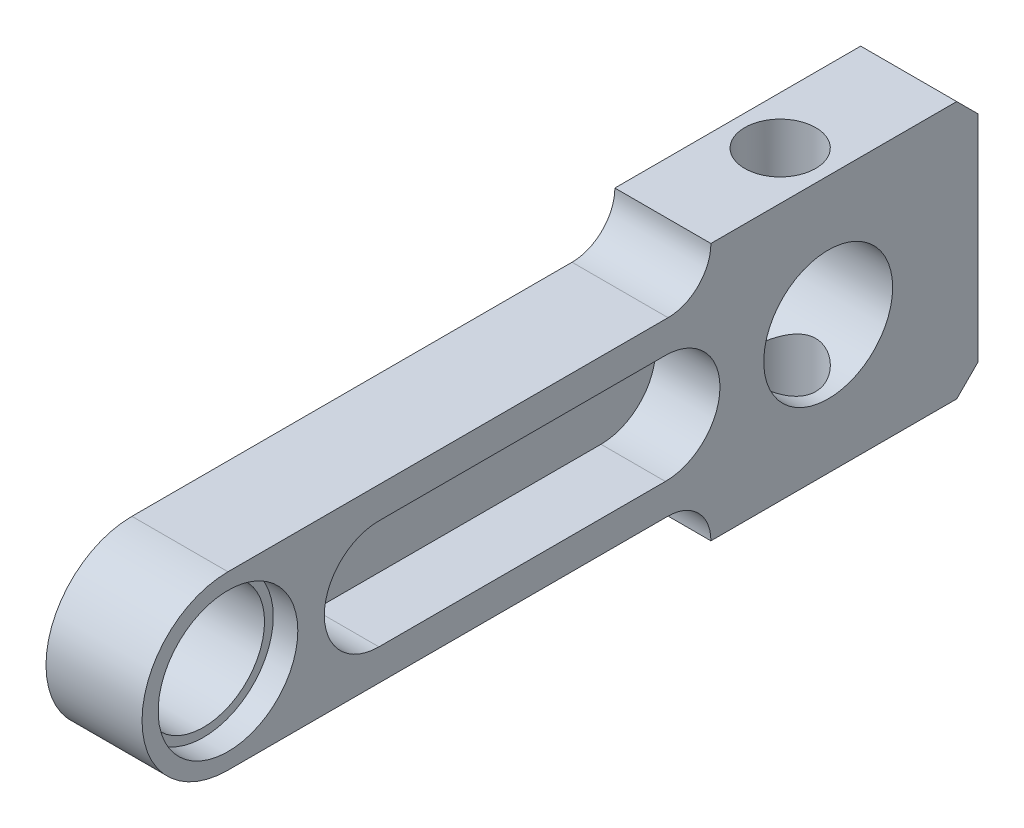
ISO-10303-21;
HEADER;
FILE_DESCRIPTION(('STEP AP214'),'2;1');
FILE_NAME('part.step','',(''),(''),'','','');
FILE_SCHEMA(('AUTOMOTIVE_DESIGN { 1 0 10303 214 1 1 1 1 }'));
ENDSEC;
DATA;
#1=APPLICATION_CONTEXT('core data for automotive mechanical design processes');
#2=APPLICATION_PROTOCOL_DEFINITION('international standard','automotive_design',2000,#1);
#3=PRODUCT_CONTEXT('',#1,'mechanical');
#4=PRODUCT('Part','Part','',(#3));
#5=PRODUCT_RELATED_PRODUCT_CATEGORY('part','',(#4));
#6=PRODUCT_DEFINITION_FORMATION('','',#4);
#7=PRODUCT_DEFINITION_CONTEXT('part definition',#1,'design');
#8=PRODUCT_DEFINITION('design','',#6,#7);
#9=PRODUCT_DEFINITION_SHAPE('','',#8);
#10=(LENGTH_UNIT() NAMED_UNIT(*) SI_UNIT(.MILLI.,.METRE.));
#11=(NAMED_UNIT(*) PLANE_ANGLE_UNIT() SI_UNIT($,.RADIAN.));
#12=(NAMED_UNIT(*) SI_UNIT($,.STERADIAN.) SOLID_ANGLE_UNIT());
#13=UNCERTAINTY_MEASURE_WITH_UNIT(LENGTH_MEASURE(1.E-05),#10,'distance_accuracy_value','');
#14=(GEOMETRIC_REPRESENTATION_CONTEXT(3) GLOBAL_UNCERTAINTY_ASSIGNED_CONTEXT((#13)) GLOBAL_UNIT_ASSIGNED_CONTEXT((#10,
#11,#12)) REPRESENTATION_CONTEXT('',''));
#15=CARTESIAN_POINT('',(0.,0.,0.));
#16=DIRECTION('',(0.,0.,1.));
#17=DIRECTION('',(1.,0.,0.));
#18=AXIS2_PLACEMENT_3D('',#15,#16,#17);
#19=CARTESIAN_POINT('',(3.49430570507718,-3.08121037131847E-06,-7.58954525222597));
#20=DIRECTION('',(-1.,0.,0.));
#21=DIRECTION('',(0.,0.,1.));
#22=AXIS2_PLACEMENT_3D('',#19,#20,#21);
#23=CYLINDRICAL_SURFACE('',#22,1.70688);
#24=CARTESIAN_POINT('',(0.812065705077182,-3.08121037131847E-06,-7.58954525222597));
#25=DIRECTION('',(1.,0.,0.));
#26=DIRECTION('',(0.,0.,-1.));
#27=AXIS2_PLACEMENT_3D('',#24,#25,#26);
#28=CIRCLE('',#27,1.70688);
#29=CARTESIAN_POINT('',(0.812065705077182,-3.08121037131847E-06,-9.29642525222597));
#30=VERTEX_POINT('',#29);
#31=EDGE_CURVE('E168',#30,#30,#28,.T.);
#32=ORIENTED_EDGE('',*,*,#31,.F.);
#33=EDGE_LOOP('',(#32));
#34=FACE_BOUND('',#33,.T.);
#35=CARTESIAN_POINT('',(2.80850570507718,-3.08121037131847E-06,-7.58954525222597));
#36=DIRECTION('',(1.,0.,0.));
#37=DIRECTION('',(0.,0.,-1.));
#38=AXIS2_PLACEMENT_3D('',#35,#36,#37);
#39=CIRCLE('',#38,1.70688);
#40=CARTESIAN_POINT('',(2.80850570507718,-3.08121037131847E-06,-9.29642525222597));
#41=VERTEX_POINT('',#40);
#42=EDGE_CURVE('E202',#41,#41,#39,.T.);
#43=ORIENTED_EDGE('',*,*,#42,.T.);
#44=EDGE_LOOP('',(#43));
#45=FACE_BOUND('',#44,.T.);
#46=ADVANCED_FACE('F35',(#34,#45),#23,.F.);
#47=CARTESIAN_POINT('',(3.49430570507718,-3.08121037131847E-06,-7.58954525222597));
#48=DIRECTION('',(1.,0.,0.));
#49=DIRECTION('',(0.,0.,-1.));
#50=AXIS2_PLACEMENT_3D('',#47,#48,#49);
#51=PLANE('',#50);
#52=CARTESIAN_POINT('',(3.49430570507718,-3.08121037131847E-06,-11.8051405121409));
#53=DIRECTION('',(1.,0.,0.));
#54=DIRECTION('',(0.,0.,-1.));
#55=AXIS2_PLACEMENT_3D('',#52,#53,#54);
#56=CIRCLE('',#55,1.524);
#57=CARTESIAN_POINT('',(3.49430570507718,1.52399691878963,-11.8051405121409));
#58=VERTEX_POINT('',#57);
#59=CARTESIAN_POINT('',(3.49430570507718,-1.52400308121037,-11.8051405121409));
#60=VERTEX_POINT('',#59);
#61=EDGE_CURVE('E57',#58,#60,#56,.T.);
#62=ORIENTED_EDGE('',*,*,#61,.F.);
#63=DIRECTION('',(0.,0.,1.));
#64=VECTOR('',#63,1.);
#65=CARTESIAN_POINT('',(3.49430570507718,1.52399691878963,-11.8051405121409));
#66=LINE('',#65,#64);
#67=CARTESIAN_POINT('',(3.49430570507718,1.52399691878963,-19.8061405121408));
#68=VERTEX_POINT('',#67);
#69=EDGE_CURVE('E351',#68,#58,#66,.T.);
#70=ORIENTED_EDGE('',*,*,#69,.F.);
#71=CARTESIAN_POINT('',(3.49430570507718,-3.08121037131847E-06,-19.8061405121408));
#72=DIRECTION('',(1.,0.,0.));
#73=DIRECTION('',(0.,0.,-1.));
#74=AXIS2_PLACEMENT_3D('',#71,#72,#73);
#75=CIRCLE('',#74,1.524);
#76=CARTESIAN_POINT('',(3.49430570507718,-1.52400308121037,-19.8061405121408));
#77=VERTEX_POINT('',#76);
#78=EDGE_CURVE('E355',#77,#68,#75,.T.);
#79=ORIENTED_EDGE('',*,*,#78,.F.);
#80=DIRECTION('',(0.,0.,-1.));
#81=VECTOR('',#80,1.);
#82=CARTESIAN_POINT('',(3.49430570507718,-1.52400308121037,-11.8051405121409));
#83=LINE('',#82,#81);
#84=EDGE_CURVE('E358',#60,#77,#83,.T.);
#85=ORIENTED_EDGE('',*,*,#84,.F.);
#86=EDGE_LOOP('',(#62,#70,#79,#85));
#87=FACE_BOUND('',#86,.T.);
#88=CARTESIAN_POINT('',(3.49430570507718,-3.08121037131847E-06,-7.58954525222597));
#89=DIRECTION('',(1.,0.,0.));
#90=DIRECTION('',(0.,0.,-1.));
#91=AXIS2_PLACEMENT_3D('',#88,#89,#90);
#92=CIRCLE('',#91,1.95072);
#93=CARTESIAN_POINT('',(3.49430570507718,-3.08121037131847E-06,-9.54026525222597));
#94=VERTEX_POINT('',#93);
#95=EDGE_CURVE('E335',#94,#94,#92,.T.);
#96=ORIENTED_EDGE('',*,*,#95,.F.);
#97=EDGE_LOOP('',(#96));
#98=FACE_BOUND('',#97,.T.);
#99=CARTESIAN_POINT('',(3.49430570507718,-3.08121037131847E-06,-7.58954525222597));
#100=DIRECTION('',(1.,0.,0.));
#101=DIRECTION('',(0.,0.,-1.));
#102=AXIS2_PLACEMENT_3D('',#99,#100,#101);
#103=CIRCLE('',#102,2.4000000768);
#104=CARTESIAN_POINT('',(3.49430570507718,2.39999699558963,-7.58954525222597));
#105=VERTEX_POINT('',#104);
#106=CARTESIAN_POINT('',(3.49430570507718,-2.40000315801037,-7.58954525222597));
#107=VERTEX_POINT('',#106);
#108=EDGE_CURVE('E184',#105,#107,#103,.T.);
#109=ORIENTED_EDGE('',*,*,#108,.T.);
#110=DIRECTION('',(0.,0.,-1.));
#111=VECTOR('',#110,1.);
#112=CARTESIAN_POINT('',(3.49430570507718,-2.40000315801037,-7.58954525222597));
#113=LINE('',#112,#111);
#114=CARTESIAN_POINT('',(3.49430570507718,-2.40000315801037,-19.880905175426));
#115=VERTEX_POINT('',#114);
#116=EDGE_CURVE('E113',#107,#115,#113,.T.);
#117=ORIENTED_EDGE('',*,*,#116,.T.);
#118=CARTESIAN_POINT('',(3.49430570507718,-3.59664308121037,-19.880905175426));
#119=DIRECTION('',(-1.,0.,0.));
#120=DIRECTION('',(0.,0.,-1.));
#121=AXIS2_PLACEMENT_3D('',#118,#119,#120);
#122=CIRCLE('',#121,1.1966399232);
#123=CARTESIAN_POINT('',(3.49430570507718,-3.59664308121037,-21.077545098626));
#124=VERTEX_POINT('',#123);
#125=EDGE_CURVE('E307',#115,#124,#122,.T.);
#126=ORIENTED_EDGE('',*,*,#125,.T.);
#127=DIRECTION('',(0.,0.,-1.));
#128=VECTOR('',#127,1.);
#129=CARTESIAN_POINT('',(3.49430570507718,-3.59664308121037,-21.077545098626));
#130=LINE('',#129,#128);
#131=CARTESIAN_POINT('',(3.49430570507718,-3.59664308121037,-27.942865175426));
#132=VERTEX_POINT('',#131);
#133=EDGE_CURVE('E320',#124,#132,#130,.T.);
#134=ORIENTED_EDGE('',*,*,#133,.T.);
#135=DIRECTION('',(0.,0.707106781186547,-0.707106781186548));
#136=VECTOR('',#135,1.);
#137=CARTESIAN_POINT('',(3.49430570507718,-3.59664308121037,-27.942865175426));
#138=LINE('',#137,#136);
#139=CARTESIAN_POINT('',(3.49430570507718,-3.00228308121037,-28.537225175426));
#140=VERTEX_POINT('',#139);
#141=EDGE_CURVE('E317',#132,#140,#138,.T.);
#142=ORIENTED_EDGE('',*,*,#141,.T.);
#143=DIRECTION('',(0.,1.,0.));
#144=VECTOR('',#143,1.);
#145=CARTESIAN_POINT('',(3.49430570507718,-3.00228308121037,-28.537225175426));
#146=LINE('',#145,#144);
#147=CARTESIAN_POINT('',(3.49430570507718,3.00227691878963,-28.537225175426));
#148=VERTEX_POINT('',#147);
#149=EDGE_CURVE('E319',#140,#148,#146,.T.);
#150=ORIENTED_EDGE('',*,*,#149,.T.);
#151=DIRECTION('',(0.,0.707106781186547,0.707106781186548));
#152=VECTOR('',#151,1.);
#153=CARTESIAN_POINT('',(3.49430570507718,3.59663691878963,-27.942865175426));
#154=LINE('',#153,#152);
#155=CARTESIAN_POINT('',(3.49430570507718,3.59663691878963,-27.942865175426));
#156=VERTEX_POINT('',#155);
#157=EDGE_CURVE('E143',#148,#156,#154,.T.);
#158=ORIENTED_EDGE('',*,*,#157,.T.);
#159=DIRECTION('',(0.,0.,1.));
#160=VECTOR('',#159,1.);
#161=CARTESIAN_POINT('',(3.49430570507718,3.59663691878963,-21.077545098626));
#162=LINE('',#161,#160);
#163=CARTESIAN_POINT('',(3.49430570507718,3.59663691878963,-21.077545098626));
#164=VERTEX_POINT('',#163);
#165=EDGE_CURVE('E135',#156,#164,#162,.T.);
#166=ORIENTED_EDGE('',*,*,#165,.T.);
#167=CARTESIAN_POINT('',(3.49430570507718,3.59663691878963,-19.880905175426));
#168=DIRECTION('',(-1.,0.,0.));
#169=DIRECTION('',(0.,0.,-1.));
#170=AXIS2_PLACEMENT_3D('',#167,#168,#169);
#171=CIRCLE('',#170,1.1966399232);
#172=CARTESIAN_POINT('',(3.49430570507718,2.39999699558963,-19.880905175426));
#173=VERTEX_POINT('',#172);
#174=EDGE_CURVE('E140',#164,#173,#171,.T.);
#175=ORIENTED_EDGE('',*,*,#174,.T.);
#176=DIRECTION('',(0.,0.,1.));
#177=VECTOR('',#176,1.);
#178=CARTESIAN_POINT('',(3.49430570507718,2.39999699558963,-7.58954525222597));
#179=LINE('',#178,#177);
#180=EDGE_CURVE('E66',#173,#105,#179,.T.);
#181=ORIENTED_EDGE('',*,*,#180,.T.);
#182=EDGE_LOOP('',(#109,#117,#126,#134,#142,#150,#158,#166,#175,#181));
#183=FACE_BOUND('',#182,.T.);
#184=CARTESIAN_POINT('',(3.49430570507718,-3.08121037131847E-06,-24.353545252226));
#185=DIRECTION('',(1.,0.,0.));
#186=DIRECTION('',(0.,0.,-1.));
#187=AXIS2_PLACEMENT_3D('',#184,#185,#186);
#188=CIRCLE('',#187,1.7999999814);
#189=CARTESIAN_POINT('',(3.49430570507718,-3.08121037131847E-06,-26.153545233626));
#190=VERTEX_POINT('',#189);
#191=EDGE_CURVE('E330',#190,#190,#188,.T.);
#192=ORIENTED_EDGE('',*,*,#191,.F.);
#193=EDGE_LOOP('',(#192));
#194=FACE_BOUND('',#193,.T.);
#195=ADVANCED_FACE('F137',(#87,#98,#183,#194),#51,.T.);
#196=CARTESIAN_POINT('',(0.812065705077182,-3.08121037131847E-06,-7.58954525222597));
#197=DIRECTION('',(1.,0.,0.));
#198=DIRECTION('',(0.,0.,-1.));
#199=AXIS2_PLACEMENT_3D('',#196,#197,#198);
#200=PLANE('',#199);
#201=ORIENTED_EDGE('',*,*,#31,.T.);
#202=EDGE_LOOP('',(#201));
#203=FACE_BOUND('',#202,.T.);
#204=CARTESIAN_POINT('',(0.812065705077182,-3.08121037131847E-06,-7.58954525222597));
#205=DIRECTION('',(1.,0.,0.));
#206=DIRECTION('',(0.,0.,-1.));
#207=AXIS2_PLACEMENT_3D('',#204,#205,#206);
#208=CIRCLE('',#207,2.4000000768);
#209=CARTESIAN_POINT('',(0.812065705077182,2.39999699558963,-7.58954525222597));
#210=VERTEX_POINT('',#209);
#211=CARTESIAN_POINT('',(0.812065705077182,-2.40000315801037,-7.58954525222597));
#212=VERTEX_POINT('',#211);
#213=EDGE_CURVE('E164',#210,#212,#208,.T.);
#214=ORIENTED_EDGE('',*,*,#213,.F.);
#215=DIRECTION('',(0.,0.,1.));
#216=VECTOR('',#215,1.);
#217=CARTESIAN_POINT('',(0.812065705077182,2.39999699558963,-7.58954525222597));
#218=LINE('',#217,#216);
#219=CARTESIAN_POINT('',(0.812065705077182,2.39999699558963,-19.880905175426));
#220=VERTEX_POINT('',#219);
#221=EDGE_CURVE('E105',#220,#210,#218,.T.);
#222=ORIENTED_EDGE('',*,*,#221,.F.);
#223=CARTESIAN_POINT('',(0.812065705077182,3.59663691878963,-19.880905175426));
#224=DIRECTION('',(-1.,0.,0.));
#225=DIRECTION('',(0.,0.,-1.));
#226=AXIS2_PLACEMENT_3D('',#223,#224,#225);
#227=CIRCLE('',#226,1.1966399232);
#228=CARTESIAN_POINT('',(0.812065705077182,3.59663691878963,-21.077545098626));
#229=VERTEX_POINT('',#228);
#230=EDGE_CURVE('E181',#229,#220,#227,.T.);
#231=ORIENTED_EDGE('',*,*,#230,.F.);
#232=DIRECTION('',(0.,0.,1.));
#233=VECTOR('',#232,1.);
#234=CARTESIAN_POINT('',(0.812065705077182,3.59663691878963,-21.077545098626));
#235=LINE('',#234,#233);
#236=CARTESIAN_POINT('',(0.812065705077182,3.59663691878963,-27.942865175426));
#237=VERTEX_POINT('',#236);
#238=EDGE_CURVE('E152',#237,#229,#235,.T.);
#239=ORIENTED_EDGE('',*,*,#238,.F.);
#240=DIRECTION('',(0.,0.707106781186547,0.707106781186548));
#241=VECTOR('',#240,1.);
#242=CARTESIAN_POINT('',(0.812065705077182,3.59663691878963,-27.942865175426));
#243=LINE('',#242,#241);
#244=CARTESIAN_POINT('',(0.812065705077182,3.00227691878963,-28.537225175426));
#245=VERTEX_POINT('',#244);
#246=EDGE_CURVE('E178',#245,#237,#243,.T.);
#247=ORIENTED_EDGE('',*,*,#246,.F.);
#248=DIRECTION('',(0.,1.,0.));
#249=VECTOR('',#248,1.);
#250=CARTESIAN_POINT('',(0.812065705077182,-3.00228308121037,-28.537225175426));
#251=LINE('',#250,#249);
#252=CARTESIAN_POINT('',(0.812065705077182,-3.00228308121037,-28.537225175426));
#253=VERTEX_POINT('',#252);
#254=EDGE_CURVE('E176',#253,#245,#251,.T.);
#255=ORIENTED_EDGE('',*,*,#254,.F.);
#256=DIRECTION('',(0.,0.707106781186547,-0.707106781186548));
#257=VECTOR('',#256,1.);
#258=CARTESIAN_POINT('',(0.812065705077182,-3.59664308121037,-27.942865175426));
#259=LINE('',#258,#257);
#260=CARTESIAN_POINT('',(0.812065705077182,-3.59664308121037,-27.942865175426));
#261=VERTEX_POINT('',#260);
#262=EDGE_CURVE('E174',#261,#253,#259,.T.);
#263=ORIENTED_EDGE('',*,*,#262,.F.);
#264=DIRECTION('',(0.,0.,-1.));
#265=VECTOR('',#264,1.);
#266=CARTESIAN_POINT('',(0.812065705077182,-3.59664308121037,-21.077545098626));
#267=LINE('',#266,#265);
#268=CARTESIAN_POINT('',(0.812065705077182,-3.59664308121037,-21.077545098626));
#269=VERTEX_POINT('',#268);
#270=EDGE_CURVE('E172',#269,#261,#267,.T.);
#271=ORIENTED_EDGE('',*,*,#270,.F.);
#272=CARTESIAN_POINT('',(0.812065705077182,-3.59664308121037,-19.880905175426));
#273=DIRECTION('',(-1.,0.,0.));
#274=DIRECTION('',(0.,0.,-1.));
#275=AXIS2_PLACEMENT_3D('',#272,#273,#274);
#276=CIRCLE('',#275,1.1966399232);
#277=CARTESIAN_POINT('',(0.812065705077182,-2.40000315801037,-19.880905175426));
#278=VERTEX_POINT('',#277);
#279=EDGE_CURVE('E170',#278,#269,#276,.T.);
#280=ORIENTED_EDGE('',*,*,#279,.F.);
#281=DIRECTION('',(0.,0.,-1.));
#282=VECTOR('',#281,1.);
#283=CARTESIAN_POINT('',(0.812065705077182,-2.40000315801037,-7.58954525222597));
#284=LINE('',#283,#282);
#285=EDGE_CURVE('E167',#212,#278,#284,.T.);
#286=ORIENTED_EDGE('',*,*,#285,.F.);
#287=EDGE_LOOP('',(#214,#222,#231,#239,#247,#255,#263,#271,#280,#286));
#288=FACE_BOUND('',#287,.T.);
#289=CARTESIAN_POINT('',(0.812065705077182,-3.08121037131847E-06,-24.353545252226));
#290=DIRECTION('',(1.,0.,0.));
#291=DIRECTION('',(0.,0.,-1.));
#292=AXIS2_PLACEMENT_3D('',#289,#290,#291);
#293=CIRCLE('',#292,1.7999999814);
#294=CARTESIAN_POINT('',(0.812065705077182,-3.08121037131847E-06,-26.153545233626));
#295=VERTEX_POINT('',#294);
#296=EDGE_CURVE('E204',#295,#295,#293,.T.);
#297=ORIENTED_EDGE('',*,*,#296,.T.);
#298=EDGE_LOOP('',(#297));
#299=FACE_BOUND('',#298,.T.);
#300=ADVANCED_FACE('F260',(#203,#288,#299),#200,.F.);
#301=CARTESIAN_POINT('',(3.49430570507718,-3.08121037131847E-06,-7.58954525222597));
#302=DIRECTION('',(-1.,0.,0.));
#303=DIRECTION('',(0.,0.,1.));
#304=AXIS2_PLACEMENT_3D('',#301,#302,#303);
#305=CYLINDRICAL_SURFACE('',#304,2.4000000768);
#306=ORIENTED_EDGE('',*,*,#213,.T.);
#307=DIRECTION('',(-1.,0.,0.));
#308=VECTOR('',#307,1.);
#309=CARTESIAN_POINT('',(3.49430570507718,-2.40000315801037,-7.58954525222597));
#310=LINE('',#309,#308);
#311=EDGE_CURVE('E11',#107,#212,#310,.T.);
#312=ORIENTED_EDGE('',*,*,#311,.F.);
#313=ORIENTED_EDGE('',*,*,#108,.F.);
#314=DIRECTION('',(-1.,0.,0.));
#315=VECTOR('',#314,1.);
#316=CARTESIAN_POINT('',(3.49430570507718,2.39999699558963,-7.58954525222597));
#317=LINE('',#316,#315);
#318=EDGE_CURVE('E160',#105,#210,#317,.T.);
#319=ORIENTED_EDGE('',*,*,#318,.T.);
#320=EDGE_LOOP('',(#306,#312,#313,#319));
#321=FACE_BOUND('',#320,.T.);
#322=ADVANCED_FACE('F37',(#321),#305,.T.);
#323=CARTESIAN_POINT('',(3.49430570507718,-2.40000315801037,-7.58954525222597));
#324=DIRECTION('',(0.,1.,0.));
#325=DIRECTION('',(0.,0.,1.));
#326=AXIS2_PLACEMENT_3D('',#323,#324,#325);
#327=PLANE('',#326);
#328=ORIENTED_EDGE('',*,*,#285,.T.);
#329=DIRECTION('',(-1.,0.,0.));
#330=VECTOR('',#329,1.);
#331=CARTESIAN_POINT('',(3.49430570507718,-2.40000315801037,-19.880905175426));
#332=LINE('',#331,#330);
#333=EDGE_CURVE('E49',#115,#278,#332,.T.);
#334=ORIENTED_EDGE('',*,*,#333,.F.);
#335=ORIENTED_EDGE('',*,*,#116,.F.);
#336=ORIENTED_EDGE('',*,*,#311,.T.);
#337=EDGE_LOOP('',(#328,#334,#335,#336));
#338=FACE_BOUND('',#337,.T.);
#339=ADVANCED_FACE('F294',(#338),#327,.F.);
#340=CARTESIAN_POINT('',(3.49430570507718,-3.59664308121037,-19.880905175426));
#341=DIRECTION('',(-1.,0.,0.));
#342=DIRECTION('',(0.,0.,1.));
#343=AXIS2_PLACEMENT_3D('',#340,#341,#342);
#344=CYLINDRICAL_SURFACE('',#343,1.1966399232);
#345=ORIENTED_EDGE('',*,*,#279,.T.);
#346=DIRECTION('',(-1.,0.,0.));
#347=VECTOR('',#346,1.);
#348=CARTESIAN_POINT('',(3.49430570507718,-3.59664308121037,-21.077545098626));
#349=LINE('',#348,#347);
#350=EDGE_CURVE('E197',#124,#269,#349,.T.);
#351=ORIENTED_EDGE('',*,*,#350,.F.);
#352=ORIENTED_EDGE('',*,*,#125,.F.);
#353=ORIENTED_EDGE('',*,*,#333,.T.);
#354=EDGE_LOOP('',(#345,#351,#352,#353));
#355=FACE_BOUND('',#354,.T.);
#356=ADVANCED_FACE('F291',(#355),#344,.F.);
#357=CARTESIAN_POINT('',(3.49430570507718,-3.59664308121037,-21.077545098626));
#358=DIRECTION('',(0.,1.,0.));
#359=DIRECTION('',(0.,0.,1.));
#360=AXIS2_PLACEMENT_3D('',#357,#358,#359);
#361=PLANE('',#360);
#362=CARTESIAN_POINT('',(2.15318570507718,-3.59664308121037,-24.353545252226));
#363=DIRECTION('',(0.,-1.,0.));
#364=DIRECTION('',(0.,0.,-1.));
#365=AXIS2_PLACEMENT_3D('',#362,#363,#364);
#366=CIRCLE('',#365,0.9906);
#367=CARTESIAN_POINT('',(2.15318570507718,-3.59664308121037,-25.344145252226));
#368=VERTEX_POINT('',#367);
#369=EDGE_CURVE('E372',#368,#368,#366,.T.);
#370=ORIENTED_EDGE('',*,*,#369,.F.);
#371=EDGE_LOOP('',(#370));
#372=FACE_BOUND('',#371,.T.);
#373=ORIENTED_EDGE('',*,*,#270,.T.);
#374=DIRECTION('',(-1.,0.,0.));
#375=VECTOR('',#374,1.);
#376=CARTESIAN_POINT('',(3.49430570507718,-3.59664308121037,-27.942865175426));
#377=LINE('',#376,#375);
#378=EDGE_CURVE('E194',#132,#261,#377,.T.);
#379=ORIENTED_EDGE('',*,*,#378,.F.);
#380=ORIENTED_EDGE('',*,*,#133,.F.);
#381=ORIENTED_EDGE('',*,*,#350,.T.);
#382=EDGE_LOOP('',(#373,#379,#380,#381));
#383=FACE_BOUND('',#382,.T.);
#384=ADVANCED_FACE('F287',(#372,#383),#361,.F.);
#385=CARTESIAN_POINT('',(3.49430570507718,-3.59664308121037,-27.942865175426));
#386=DIRECTION('',(0.,0.707106781186548,0.707106781186547));
#387=DIRECTION('',(0.,-0.707106781186547,0.707106781186548));
#388=AXIS2_PLACEMENT_3D('',#385,#386,#387);
#389=PLANE('',#388);
#390=ORIENTED_EDGE('',*,*,#262,.T.);
#391=DIRECTION('',(-1.,0.,0.));
#392=VECTOR('',#391,1.);
#393=CARTESIAN_POINT('',(3.49430570507718,-3.00228308121037,-28.537225175426));
#394=LINE('',#393,#392);
#395=EDGE_CURVE('E191',#140,#253,#394,.T.);
#396=ORIENTED_EDGE('',*,*,#395,.F.);
#397=ORIENTED_EDGE('',*,*,#141,.F.);
#398=ORIENTED_EDGE('',*,*,#378,.T.);
#399=EDGE_LOOP('',(#390,#396,#397,#398));
#400=FACE_BOUND('',#399,.T.);
#401=ADVANCED_FACE('F283',(#400),#389,.F.);
#402=CARTESIAN_POINT('',(3.49430570507718,-3.00228308121037,-28.537225175426));
#403=DIRECTION('',(0.,0.,1.));
#404=DIRECTION('',(1.,0.,0.));
#405=AXIS2_PLACEMENT_3D('',#402,#403,#404);
#406=PLANE('',#405);
#407=ORIENTED_EDGE('',*,*,#254,.T.);
#408=DIRECTION('',(-1.,0.,0.));
#409=VECTOR('',#408,1.);
#410=CARTESIAN_POINT('',(3.49430570507718,3.00227691878963,-28.537225175426));
#411=LINE('',#410,#409);
#412=EDGE_CURVE('E188',#148,#245,#411,.T.);
#413=ORIENTED_EDGE('',*,*,#412,.F.);
#414=ORIENTED_EDGE('',*,*,#149,.F.);
#415=ORIENTED_EDGE('',*,*,#395,.T.);
#416=EDGE_LOOP('',(#407,#413,#414,#415));
#417=FACE_BOUND('',#416,.T.);
#418=ADVANCED_FACE('F279',(#417),#406,.F.);
#419=CARTESIAN_POINT('',(3.49430570507718,3.59663691878963,-27.942865175426));
#420=DIRECTION('',(0.,-0.707106781186548,0.707106781186547));
#421=DIRECTION('',(0.,-0.707106781186547,-0.707106781186548));
#422=AXIS2_PLACEMENT_3D('',#419,#420,#421);
#423=PLANE('',#422);
#424=ORIENTED_EDGE('',*,*,#246,.T.);
#425=DIRECTION('',(-1.,0.,0.));
#426=VECTOR('',#425,1.);
#427=CARTESIAN_POINT('',(3.49430570507718,3.59663691878963,-27.942865175426));
#428=LINE('',#427,#426);
#429=EDGE_CURVE('E155',#156,#237,#428,.T.);
#430=ORIENTED_EDGE('',*,*,#429,.F.);
#431=ORIENTED_EDGE('',*,*,#157,.F.);
#432=ORIENTED_EDGE('',*,*,#412,.T.);
#433=EDGE_LOOP('',(#424,#430,#431,#432));
#434=FACE_BOUND('',#433,.T.);
#435=ADVANCED_FACE('F275',(#434),#423,.F.);
#436=CARTESIAN_POINT('',(3.49430570507718,3.59663691878963,-21.077545098626));
#437=DIRECTION('',(0.,-1.,0.));
#438=DIRECTION('',(0.,0.,-1.));
#439=AXIS2_PLACEMENT_3D('',#436,#437,#438);
#440=PLANE('',#439);
#441=CARTESIAN_POINT('',(2.15318570507718,3.59663691878963,-24.353545252226));
#442=DIRECTION('',(0.,-1.,0.));
#443=DIRECTION('',(0.,0.,-1.));
#444=AXIS2_PLACEMENT_3D('',#441,#442,#443);
#445=CIRCLE('',#444,0.9906);
#446=CARTESIAN_POINT('',(2.15318570507718,3.59663691878963,-25.344145252226));
#447=VERTEX_POINT('',#446);
#448=EDGE_CURVE('E211',#447,#447,#445,.T.);
#449=ORIENTED_EDGE('',*,*,#448,.T.);
#450=EDGE_LOOP('',(#449));
#451=FACE_BOUND('',#450,.T.);
#452=ORIENTED_EDGE('',*,*,#238,.T.);
#453=DIRECTION('',(-1.,0.,0.));
#454=VECTOR('',#453,1.);
#455=CARTESIAN_POINT('',(3.49430570507718,3.59663691878963,-21.077545098626));
#456=LINE('',#455,#454);
#457=EDGE_CURVE('E149',#164,#229,#456,.T.);
#458=ORIENTED_EDGE('',*,*,#457,.F.);
#459=ORIENTED_EDGE('',*,*,#165,.F.);
#460=ORIENTED_EDGE('',*,*,#429,.T.);
#461=EDGE_LOOP('',(#452,#458,#459,#460));
#462=FACE_BOUND('',#461,.T.);
#463=ADVANCED_FACE('F150',(#451,#462),#440,.F.);
#464=CARTESIAN_POINT('',(3.49430570507718,3.59663691878963,-19.880905175426));
#465=DIRECTION('',(-1.,0.,0.));
#466=DIRECTION('',(0.,0.,1.));
#467=AXIS2_PLACEMENT_3D('',#464,#465,#466);
#468=CYLINDRICAL_SURFACE('',#467,1.1966399232);
#469=ORIENTED_EDGE('',*,*,#230,.T.);
#470=DIRECTION('',(-1.,0.,0.));
#471=VECTOR('',#470,1.);
#472=CARTESIAN_POINT('',(3.49430570507718,2.39999699558963,-19.880905175426));
#473=LINE('',#472,#471);
#474=EDGE_CURVE('E156',#173,#220,#473,.T.);
#475=ORIENTED_EDGE('',*,*,#474,.F.);
#476=ORIENTED_EDGE('',*,*,#174,.F.);
#477=ORIENTED_EDGE('',*,*,#457,.T.);
#478=EDGE_LOOP('',(#469,#475,#476,#477));
#479=FACE_BOUND('',#478,.T.);
#480=ADVANCED_FACE('F158',(#479),#468,.F.);
#481=CARTESIAN_POINT('',(3.49430570507718,2.39999699558963,-7.58954525222597));
#482=DIRECTION('',(0.,-1.,0.));
#483=DIRECTION('',(0.,0.,-1.));
#484=AXIS2_PLACEMENT_3D('',#481,#482,#483);
#485=PLANE('',#484);
#486=ORIENTED_EDGE('',*,*,#221,.T.);
#487=ORIENTED_EDGE('',*,*,#318,.F.);
#488=ORIENTED_EDGE('',*,*,#180,.F.);
#489=ORIENTED_EDGE('',*,*,#474,.T.);
#490=EDGE_LOOP('',(#486,#487,#488,#489));
#491=FACE_BOUND('',#490,.T.);
#492=ADVANCED_FACE('F251',(#491),#485,.F.);
#493=CARTESIAN_POINT('',(3.49430570507718,-3.08121037131847E-06,-24.353545252226));
#494=DIRECTION('',(-1.,0.,0.));
#495=DIRECTION('',(0.,0.,1.));
#496=AXIS2_PLACEMENT_3D('',#493,#494,#495);
#497=CYLINDRICAL_SURFACE('',#496,1.7999999814);
#498=CARTESIAN_POINT('',(2.15318570507718,1.50289797110146,-25.344145252226));
#499=CARTESIAN_POINT('',(2.2039478107877,1.50290334140621,-25.3441414006557));
#500=CARTESIAN_POINT('',(2.25475415161173,1.50551050763704,-25.340216265151));
#501=CARTESIAN_POINT('',(2.35473789682319,1.51553089022028,-25.3247484309233));
#502=CARTESIAN_POINT('',(2.4039124125469,1.52295219644592,-25.3131929092072));
#503=CARTESIAN_POINT('',(2.49898587387415,1.54146500989848,-25.2831591447625));
#504=CARTESIAN_POINT('',(2.54490318087825,1.5525335568234,-25.264724116434));
#505=CARTESIAN_POINT('',(2.63297568992143,1.5770563497451,-25.2215876187346));
#506=CARTESIAN_POINT('',(2.67513010226209,1.59051109475912,-25.1968848381444));
#507=CARTESIAN_POINT('',(2.75917494101891,1.61994468766617,-25.1389914939823));
#508=CARTESIAN_POINT('',(2.80060690571394,1.63604117825289,-25.1051949491186));
#509=CARTESIAN_POINT('',(2.87758268991778,1.66800039313585,-25.0313249197451));
#510=CARTESIAN_POINT('',(2.9131229775252,1.68386297205522,-24.9912476979396));
#511=CARTESIAN_POINT('',(2.98031528261657,1.71519270133961,-24.9017572532088));
#512=CARTESIAN_POINT('',(3.01137011787941,1.73050854550999,-24.851837561192));
#513=CARTESIAN_POINT('',(3.06442728856288,1.757423744853,-24.7464796793044));
#514=CARTESIAN_POINT('',(3.08643653032625,1.76902593391173,-24.6910457398977));
#515=CARTESIAN_POINT('',(3.11884798804472,1.78634632876163,-24.5811175564782));
#516=CARTESIAN_POINT('',(3.13006401421386,1.79247399718605,-24.5269293356533));
#517=CARTESIAN_POINT('',(3.14328522734263,1.79971249736869,-24.4171245831637));
#518=CARTESIAN_POINT('',(3.1452974076939,1.80082713818313,-24.3615091682539));
#519=CARTESIAN_POINT('',(3.14028726541488,1.79807358648901,-24.2566941961445));
#520=CARTESIAN_POINT('',(3.13418995385127,1.79471551544199,-24.207433262974));
#521=CARTESIAN_POINT('',(3.11483841430234,1.78421145209855,-24.1107647324111));
#522=CARTESIAN_POINT('',(3.10158363658916,1.77706516884997,-24.0633572776748));
#523=CARTESIAN_POINT('',(3.0682945611121,1.75952361737373,-23.9710548413027));
#524=CARTESIAN_POINT('',(3.04818898248159,1.74909428043684,-23.9261923107292));
#525=CARTESIAN_POINT('',(3.00191374524737,1.72587368659719,-23.8403906000785));
#526=CARTESIAN_POINT('',(2.9757421489427,1.7130816752383,-23.7994526795803));
#527=CARTESIAN_POINT('',(2.91486102271399,1.68465093408167,-23.717936024637));
#528=CARTESIAN_POINT('',(2.8795348431931,1.66885397002995,-23.67787300301));
#529=CARTESIAN_POINT('',(2.80296262183925,1.63697852262192,-23.6039348879938));
#530=CARTESIAN_POINT('',(2.76171048167961,1.6208997644275,-23.5700662517994));
#531=CARTESIAN_POINT('',(2.67008618225488,1.58867587177586,-23.5065049106022));
#532=CARTESIAN_POINT('',(2.6192309800483,1.57264931781616,-23.4774416276858));
#533=CARTESIAN_POINT('',(2.51232616664847,1.54435875827733,-23.4284764915746));
#534=CARTESIAN_POINT('',(2.4562826526281,1.53209040744397,-23.4085640447035));
#535=CARTESIAN_POINT('',(2.34524626238498,1.51421342867822,-23.3801948230876));
#536=CARTESIAN_POINT('',(2.29053419238059,1.50814690190836,-23.3709426269578));
#537=CARTESIAN_POINT('',(2.18002455558602,1.50212993596515,-23.3617629157841));
#538=CARTESIAN_POINT('',(2.12422830785059,1.50217247949178,-23.3618247020609));
#539=CARTESIAN_POINT('',(2.02187169272458,1.50788351960551,-23.3705432992294));
#540=CARTESIAN_POINT('',(1.97514948183153,1.51273193055831,-23.3779472960074));
#541=CARTESIAN_POINT('',(1.88374139984813,1.52619019096677,-23.3991394215793));
#542=CARTESIAN_POINT('',(1.83905643414363,1.53480169515135,-23.412930359035));
#543=CARTESIAN_POINT('',(1.7507969059496,1.55521493918943,-23.4470653228894));
#544=CARTESIAN_POINT('',(1.707348287459,1.5671357227963,-23.4676607866484));
#545=CARTESIAN_POINT('',(1.62426320095359,1.59276368218815,-23.5146118905067));
#546=CARTESIAN_POINT('',(1.58462863152388,1.60647173974197,-23.5409703782235));
#547=CARTESIAN_POINT('',(1.5037034473125,1.63673581381598,-23.6035613330416));
#548=CARTESIAN_POINT('',(1.46314793090721,1.65339859734666,-23.6406969009903));
#549=CARTESIAN_POINT('',(1.38854967597003,1.68589489280084,-23.7213740618666));
#550=CARTESIAN_POINT('',(1.3545107687657,1.7017279129311,-23.7649193968582));
#551=CARTESIAN_POINT('',(1.29230882854511,1.73177093293342,-23.8600210213355));
#552=CARTESIAN_POINT('',(1.26453180558423,1.74585773709227,-23.9118717669395));
#553=CARTESIAN_POINT('',(1.21838998023676,1.76978893173406,-24.0205027081908));
#554=CARTESIAN_POINT('',(1.20001538280521,1.77963773547561,-24.0772777015373));
#555=CARTESIAN_POINT('',(1.17505620031986,1.79313705597075,-24.187917820652));
#556=CARTESIAN_POINT('',(1.16746108595977,1.79731687124108,-24.2414900168233));
#557=CARTESIAN_POINT('',(1.16112659101957,1.80079797444567,-24.3493036718345));
#558=CARTESIAN_POINT('',(1.16238253283206,1.80010183922411,-24.4035447620489));
#559=CARTESIAN_POINT('',(1.17315355005769,1.79419826615966,-24.5059908128549));
#560=CARTESIAN_POINT('',(1.18191920948584,1.78940025525263,-24.5543014517141));
#561=CARTESIAN_POINT('',(1.20630810144309,1.77628048356094,-24.6486485639164));
#562=CARTESIAN_POINT('',(1.22193215128123,1.76795830280789,-24.694684765489));
#563=CARTESIAN_POINT('',(1.26008267596399,1.74815881955909,-24.7849853821139));
#564=CARTESIAN_POINT('',(1.28282638414457,1.73658359191712,-24.8291358239542));
#565=CARTESIAN_POINT('',(1.3343002088236,1.71136534187112,-24.9131384273464));
#566=CARTESIAN_POINT('',(1.36303274274792,1.69772148506048,-24.9529888432778));
#567=CARTESIAN_POINT('',(1.4294587296742,1.66778390712365,-25.0321285260649));
#568=CARTESIAN_POINT('',(1.46780289293032,1.65136593165301,-25.0708254427619));
#569=CARTESIAN_POINT('',(1.5504198049872,1.61882260944995,-25.1415312643186));
#570=CARTESIAN_POINT('',(1.59469968407378,1.60269764156703,-25.1735320051097));
#571=CARTESIAN_POINT('',(1.69158526904343,1.57147542815516,-25.2319667157276));
#572=CARTESIAN_POINT('',(1.74454918109879,1.55651829907522,-25.2578875428132));
#573=CARTESIAN_POINT('',(1.85514012435117,1.53123292369113,-25.3000822080843));
#574=CARTESIAN_POINT('',(1.91275162795592,1.5208899608031,-25.3163867710906));
#575=CARTESIAN_POINT('',(2.00146566039693,1.51024424979601,-25.3329287967582));
#576=CARTESIAN_POINT('',(2.03158470543061,1.50750581037609,-25.3371244729086));
#577=CARTESIAN_POINT('',(2.09219241648285,1.50383107890929,-25.3427338247555));
#578=CARTESIAN_POINT('',(2.12268107367389,1.50289474390738,-25.3441475667622));
#579=CARTESIAN_POINT('',(2.15318570507718,1.50289797110146,-25.344145252226));
#580=B_SPLINE_CURVE_WITH_KNOTS('',3,(#498,#499,#500,#501,#502,#503,#504,#505,#506,#507,#508,
#509,#510,#511,#512,#513,#514,#515,#516,#517,#518,#519,#520,#521,#522,#523,#524,#525,#526,#527,
#528,#529,#530,#531,#532,#533,#534,#535,#536,#537,#538,#539,#540,#541,#542,#543,#544,#545,#546,
#547,#548,#549,#550,#551,#552,#553,#554,#555,#556,#557,#558,#559,#560,#561,#562,#563,#564,#565,
#566,#567,#568,#569,#570,#571,#572,#573,#574,#575,#576,#577,#578,#579),.UNSPECIFIED.,.T.,.F.,(4,
2,2,2,2,2,2,2,2,2,2,2,2,2,2,2,2,2,2,2,2,2,2,2,2,2,2,2,2,2,2,2,2,2,2,2,2,2,2,2,4),(0.,
0.152156796312938,0.304569947682928,0.456041387446733,0.607544541334338,0.77438023570392,
0.941315584706136,1.12260628913764,1.30375831917716,1.4698280344957,1.63577154347364,
1.78431848862181,1.93287684451374,2.08303066518123,2.23323251656459,2.39964671120679,
2.56623340388052,2.74747416077004,2.92850456826392,3.09491201975709,3.26112832569043,
3.40314221168674,3.54521860778029,3.69327630187527,3.84140732003914,4.01304251034917,
4.18477830277041,4.36523226522231,4.54549785376425,4.70739613324706,4.86920885912342,
5.01653623488916,5.16388117231172,5.31625129016175,5.46868303266196,5.63865689994375,
5.80883680950218,5.99035857042141,6.17129716633851,6.26273540674887,6.35417146760698),.UNSPECIFIED.);
#581=CARTESIAN_POINT('',(2.15318570507718,1.50289797110146,-25.344145252226));
#582=VERTEX_POINT('',#581);
#583=EDGE_CURVE('E39',#582,#582,#580,.T.);
#584=ORIENTED_EDGE('',*,*,#583,.F.);
#585=EDGE_LOOP('',(#584));
#586=FACE_BOUND('',#585,.T.);
#587=CARTESIAN_POINT('',(2.15318570507718,-1.5029041335222,-25.344145252226));
#588=CARTESIAN_POINT('',(2.10242359936667,-1.50290950382695,-25.3441414006557));
#589=CARTESIAN_POINT('',(2.05161725854264,-1.50551667005779,-25.340216265151));
#590=CARTESIAN_POINT('',(1.95163351333118,-1.51553705264103,-25.3247484309233));
#591=CARTESIAN_POINT('',(1.90245899760747,-1.52295835886666,-25.3131929092072));
#592=CARTESIAN_POINT('',(1.80738553628021,-1.54147117231923,-25.2831591447625));
#593=CARTESIAN_POINT('',(1.76146822927612,-1.55253971924414,-25.264724116434));
#594=CARTESIAN_POINT('',(1.67339572023293,-1.57706251216584,-25.2215876187346));
#595=CARTESIAN_POINT('',(1.63124130789227,-1.59051725717987,-25.1968848381444));
#596=CARTESIAN_POINT('',(1.54719646913545,-1.61995085008691,-25.1389914939823));
#597=CARTESIAN_POINT('',(1.50576450444042,-1.63604734067363,-25.1051949491186));
#598=CARTESIAN_POINT('',(1.42878872023658,-1.66800655555659,-25.0313249197451));
#599=CARTESIAN_POINT('',(1.39324843262917,-1.68386913447596,-24.9912476979396));
#600=CARTESIAN_POINT('',(1.32605612753779,-1.71519886376035,-24.9017572532088));
#601=CARTESIAN_POINT('',(1.29500129227496,-1.73051470793073,-24.851837561192));
#602=CARTESIAN_POINT('',(1.24194412159148,-1.75742990727374,-24.7464796793044));
#603=CARTESIAN_POINT('',(1.21993487982811,-1.76903209633247,-24.6910457398977));
#604=CARTESIAN_POINT('',(1.18752342210964,-1.78635249118237,-24.5811175564782));
#605=CARTESIAN_POINT('',(1.1763073959405,-1.79248015960679,-24.5269293356533));
#606=CARTESIAN_POINT('',(1.16308618281174,-1.79971865978943,-24.4171245831637));
#607=CARTESIAN_POINT('',(1.16107400246046,-1.80083330060387,-24.3615091682539));
#608=CARTESIAN_POINT('',(1.16608414473949,-1.79807974890975,-24.2566941961445));
#609=CARTESIAN_POINT('',(1.1721814563031,-1.79472167786273,-24.207433262974));
#610=CARTESIAN_POINT('',(1.19153299585202,-1.78421761451929,-24.1107647324111));
#611=CARTESIAN_POINT('',(1.2047877735652,-1.77707133127071,-24.0633572776748));
#612=CARTESIAN_POINT('',(1.23807684904227,-1.75952977979447,-23.9710548413027));
#613=CARTESIAN_POINT('',(1.25818242767277,-1.74910044285758,-23.9261923107292));
#614=CARTESIAN_POINT('',(1.30445766490699,-1.72587984901793,-23.8403906000785));
#615=CARTESIAN_POINT('',(1.33062926121166,-1.71308783765904,-23.7994526795803));
#616=CARTESIAN_POINT('',(1.39151038744037,-1.68465709650241,-23.717936024637));
#617=CARTESIAN_POINT('',(1.42683656696127,-1.6688601324507,-23.67787300301));
#618=CARTESIAN_POINT('',(1.50340878831511,-1.63698468504266,-23.6039348879938));
#619=CARTESIAN_POINT('',(1.54466092847475,-1.62090592684825,-23.5700662517994));
#620=CARTESIAN_POINT('',(1.63628522789948,-1.58868203419661,-23.5065049106022));
#621=CARTESIAN_POINT('',(1.68714043010607,-1.57265548023691,-23.4774416276858));
#622=CARTESIAN_POINT('',(1.7940452435059,-1.54436492069807,-23.4284764915746));
#623=CARTESIAN_POINT('',(1.85008875752626,-1.53209656986471,-23.4085640447035));
#624=CARTESIAN_POINT('',(1.96112514776938,-1.51421959109896,-23.3801948230876));
#625=CARTESIAN_POINT('',(2.01583721777377,-1.5081530643291,-23.3709426269578));
#626=CARTESIAN_POINT('',(2.12634685456834,-1.5021360983859,-23.3617629157841));
#627=CARTESIAN_POINT('',(2.18214310230377,-1.50217864191252,-23.3618247020609));
#628=CARTESIAN_POINT('',(2.28449971742978,-1.50788968202626,-23.3705432992294));
#629=CARTESIAN_POINT('',(2.33122192832283,-1.51273809297905,-23.3779472960074));
#630=CARTESIAN_POINT('',(2.42263001030623,-1.52619635338751,-23.3991394215793));
#631=CARTESIAN_POINT('',(2.46731497601073,-1.53480785757209,-23.412930359035));
#632=CARTESIAN_POINT('',(2.55557450420476,-1.55522110161017,-23.4470653228894));
#633=CARTESIAN_POINT('',(2.59902312269536,-1.56714188521705,-23.4676607866484));
#634=CARTESIAN_POINT('',(2.68210820920077,-1.59276984460889,-23.5146118905067));
#635=CARTESIAN_POINT('',(2.72174277863048,-1.60647790216271,-23.5409703782235));
#636=CARTESIAN_POINT('',(2.80266796284187,-1.63674197623672,-23.6035613330416));
#637=CARTESIAN_POINT('',(2.84322347924716,-1.6534047597674,-23.6406969009903));
#638=CARTESIAN_POINT('',(2.91782173418433,-1.68590105522158,-23.7213740618666));
#639=CARTESIAN_POINT('',(2.95186064138866,-1.70173407535184,-23.7649193968582));
#640=CARTESIAN_POINT('',(3.01406258160925,-1.73177709535416,-23.8600210213355));
#641=CARTESIAN_POINT('',(3.04183960457013,-1.74586389951301,-23.9118717669395));
#642=CARTESIAN_POINT('',(3.0879814299176,-1.7697950941548,-24.0205027081908));
#643=CARTESIAN_POINT('',(3.10635602734915,-1.77964389789635,-24.0772777015373));
#644=CARTESIAN_POINT('',(3.1313152098345,-1.79314321839149,-24.187917820652));
#645=CARTESIAN_POINT('',(3.13891032419459,-1.79732303366182,-24.2414900168233));
#646=CARTESIAN_POINT('',(3.1452448191348,-1.80080413686641,-24.3493036718345));
#647=CARTESIAN_POINT('',(3.1439888773223,-1.80010800164485,-24.4035447620489));
#648=CARTESIAN_POINT('',(3.13321786009667,-1.7942044285804,-24.5059908128549));
#649=CARTESIAN_POINT('',(3.12445220066852,-1.78940641767337,-24.5543014517141));
#650=CARTESIAN_POINT('',(3.10006330871127,-1.77628664598169,-24.6486485639164));
#651=CARTESIAN_POINT('',(3.08443925887314,-1.76796446522863,-24.694684765489));
#652=CARTESIAN_POINT('',(3.04628873419038,-1.74816498197983,-24.7849853821139));
#653=CARTESIAN_POINT('',(3.0235450260098,-1.73658975433786,-24.8291358239542));
#654=CARTESIAN_POINT('',(2.97207120133077,-1.71137150429186,-24.9131384273464));
#655=CARTESIAN_POINT('',(2.94333866740644,-1.69772764748123,-24.9529888432778));
#656=CARTESIAN_POINT('',(2.87691268048017,-1.66779006954439,-25.0321285260649));
#657=CARTESIAN_POINT('',(2.83856851722404,-1.65137209407376,-25.0708254427619));
#658=CARTESIAN_POINT('',(2.75595160516716,-1.61882877187069,-25.1415312643186));
#659=CARTESIAN_POINT('',(2.71167172608059,-1.60270380398777,-25.1735320051097));
#660=CARTESIAN_POINT('',(2.61478614111093,-1.5714815905759,-25.2319667157276));
#661=CARTESIAN_POINT('',(2.56182222905557,-1.55652446149596,-25.2578875428132));
#662=CARTESIAN_POINT('',(2.4512312858032,-1.53123908611187,-25.3000822080843));
#663=CARTESIAN_POINT('',(2.39361978219845,-1.52089612322385,-25.3163867710906));
#664=CARTESIAN_POINT('',(2.30490574975744,-1.51025041221675,-25.3329287967582));
#665=CARTESIAN_POINT('',(2.27478670472375,-1.50751197279683,-25.3371244729086));
#666=CARTESIAN_POINT('',(2.21417899367151,-1.50383724133003,-25.3427338247555));
#667=CARTESIAN_POINT('',(2.18369033648048,-1.50290090632812,-25.3441475667622));
#668=CARTESIAN_POINT('',(2.15318570507718,-1.5029041335222,-25.344145252226));
#669=B_SPLINE_CURVE_WITH_KNOTS('',3,(#587,#588,#589,#590,#591,#592,#593,#594,#595,#596,#597,
#598,#599,#600,#601,#602,#603,#604,#605,#606,#607,#608,#609,#610,#611,#612,#613,#614,#615,#616,
#617,#618,#619,#620,#621,#622,#623,#624,#625,#626,#627,#628,#629,#630,#631,#632,#633,#634,#635,
#636,#637,#638,#639,#640,#641,#642,#643,#644,#645,#646,#647,#648,#649,#650,#651,#652,#653,#654,
#655,#656,#657,#658,#659,#660,#661,#662,#663,#664,#665,#666,#667,#668),.UNSPECIFIED.,.T.,.F.,(4,
2,2,2,2,2,2,2,2,2,2,2,2,2,2,2,2,2,2,2,2,2,2,2,2,2,2,2,2,2,2,2,2,2,2,2,2,2,2,2,4),(0.,
0.152156796312939,0.304569947682928,0.456041387446732,0.607544541334337,0.774380235703918,
0.941315584706132,1.12260628913764,1.30375831917716,1.4698280344957,1.63577154347363,
1.78431848862181,1.93287684451373,2.08303066518122,2.23323251656459,2.39964671120679,
2.56623340388053,2.74747416077004,2.92850456826392,3.09491201975708,3.26112832569043,
3.40314221168674,3.54521860778029,3.69327630187527,3.84140732003914,4.01304251034917,
4.18477830277041,4.36523226522231,4.54549785376425,4.70739613324705,4.86920885912342,
5.01653623488916,5.16388117231172,5.31625129016174,5.46868303266196,5.63865689994375,
5.80883680950218,5.99035857042141,6.17129716633851,6.26273540674887,6.35417146760698),.UNSPECIFIED.);
#670=CARTESIAN_POINT('',(2.15318570507718,-1.5029041335222,-25.344145252226));
#671=VERTEX_POINT('',#670);
#672=EDGE_CURVE('E206',#671,#671,#669,.T.);
#673=ORIENTED_EDGE('',*,*,#672,.F.);
#674=EDGE_LOOP('',(#673));
#675=FACE_BOUND('',#674,.T.);
#676=ORIENTED_EDGE('',*,*,#191,.T.);
#677=EDGE_LOOP('',(#676));
#678=FACE_BOUND('',#677,.T.);
#679=ORIENTED_EDGE('',*,*,#296,.F.);
#680=EDGE_LOOP('',(#679));
#681=FACE_BOUND('',#680,.T.);
#682=ADVANCED_FACE('F212',(#586,#675,#678,#681),#497,.F.);
#683=CARTESIAN_POINT('',(2.80850570507718,-3.08121037131847E-06,-7.58954525222597));
#684=DIRECTION('',(1.,0.,0.));
#685=DIRECTION('',(0.,0.,-1.));
#686=AXIS2_PLACEMENT_3D('',#683,#684,#685);
#687=CYLINDRICAL_SURFACE('',#686,1.95072);
#688=CARTESIAN_POINT('',(2.80850570507718,-3.08121037131847E-06,-7.58954525222597));
#689=DIRECTION('',(1.,0.,0.));
#690=DIRECTION('',(0.,0.,-1.));
#691=AXIS2_PLACEMENT_3D('',#688,#689,#690);
#692=CIRCLE('',#691,1.95072);
#693=CARTESIAN_POINT('',(2.80850570507718,-3.08121037131847E-06,-9.54026525222597));
#694=VERTEX_POINT('',#693);
#695=EDGE_CURVE('E205',#694,#694,#692,.T.);
#696=ORIENTED_EDGE('',*,*,#695,.F.);
#697=EDGE_LOOP('',(#696));
#698=FACE_BOUND('',#697,.T.);
#699=ORIENTED_EDGE('',*,*,#95,.T.);
#700=EDGE_LOOP('',(#699));
#701=FACE_BOUND('',#700,.T.);
#702=ADVANCED_FACE('F244',(#698,#701),#687,.F.);
#703=CARTESIAN_POINT('',(2.80850570507718,-3.08121037131847E-06,-7.58954525222597));
#704=DIRECTION('',(1.,0.,0.));
#705=DIRECTION('',(0.,0.,-1.));
#706=AXIS2_PLACEMENT_3D('',#703,#704,#705);
#707=PLANE('',#706);
#708=ORIENTED_EDGE('',*,*,#42,.F.);
#709=EDGE_LOOP('',(#708));
#710=FACE_BOUND('',#709,.T.);
#711=ORIENTED_EDGE('',*,*,#695,.T.);
#712=EDGE_LOOP('',(#711));
#713=FACE_BOUND('',#712,.T.);
#714=ADVANCED_FACE('F242',(#710,#713),#707,.T.);
#715=CARTESIAN_POINT('',(1.69598570507718,-3.08121037131847E-06,-11.8051405121409));
#716=DIRECTION('',(1.,0.,0.));
#717=DIRECTION('',(0.,0.,-1.));
#718=AXIS2_PLACEMENT_3D('',#715,#716,#717);
#719=CYLINDRICAL_SURFACE('',#718,1.524);
#720=ORIENTED_EDGE('',*,*,#61,.T.);
#721=DIRECTION('',(1.,0.,0.));
#722=VECTOR('',#721,1.);
#723=CARTESIAN_POINT('',(1.69598570507718,-1.52400308121037,-11.8051405121409));
#724=LINE('',#723,#722);
#725=CARTESIAN_POINT('',(1.69598570507718,-1.52400308121037,-11.8051405121409));
#726=VERTEX_POINT('',#725);
#727=EDGE_CURVE('E341',#726,#60,#724,.T.);
#728=ORIENTED_EDGE('',*,*,#727,.F.);
#729=CARTESIAN_POINT('',(1.69598570507718,-3.08121037131847E-06,-11.8051405121409));
#730=DIRECTION('',(1.,0.,0.));
#731=DIRECTION('',(0.,0.,-1.));
#732=AXIS2_PLACEMENT_3D('',#729,#730,#731);
#733=CIRCLE('',#732,1.524);
#734=CARTESIAN_POINT('',(1.69598570507718,1.52399691878963,-11.8051405121409));
#735=VERTEX_POINT('',#734);
#736=EDGE_CURVE('E354',#735,#726,#733,.T.);
#737=ORIENTED_EDGE('',*,*,#736,.F.);
#738=DIRECTION('',(1.,0.,0.));
#739=VECTOR('',#738,1.);
#740=CARTESIAN_POINT('',(1.69598570507718,1.52399691878963,-11.8051405121409));
#741=LINE('',#740,#739);
#742=EDGE_CURVE('E338',#735,#58,#741,.T.);
#743=ORIENTED_EDGE('',*,*,#742,.T.);
#744=EDGE_LOOP('',(#720,#728,#737,#743));
#745=FACE_BOUND('',#744,.T.);
#746=ADVANCED_FACE('F232',(#745),#719,.F.);
#747=CARTESIAN_POINT('',(1.69598570507718,1.52399691878963,-11.8051405121409));
#748=DIRECTION('',(0.,1.,0.));
#749=DIRECTION('',(0.,0.,1.));
#750=AXIS2_PLACEMENT_3D('',#747,#748,#749);
#751=PLANE('',#750);
#752=ORIENTED_EDGE('',*,*,#69,.T.);
#753=ORIENTED_EDGE('',*,*,#742,.F.);
#754=DIRECTION('',(0.,0.,1.));
#755=VECTOR('',#754,1.);
#756=CARTESIAN_POINT('',(1.69598570507718,1.52399691878963,-11.8051405121409));
#757=LINE('',#756,#755);
#758=CARTESIAN_POINT('',(1.69598570507718,1.52399691878963,-19.8061405121408));
#759=VERTEX_POINT('',#758);
#760=EDGE_CURVE('E344',#759,#735,#757,.T.);
#761=ORIENTED_EDGE('',*,*,#760,.F.);
#762=DIRECTION('',(1.,0.,0.));
#763=VECTOR('',#762,1.);
#764=CARTESIAN_POINT('',(1.69598570507718,1.52399691878963,-19.8061405121408));
#765=LINE('',#764,#763);
#766=EDGE_CURVE('E347',#759,#68,#765,.T.);
#767=ORIENTED_EDGE('',*,*,#766,.T.);
#768=EDGE_LOOP('',(#752,#753,#761,#767));
#769=FACE_BOUND('',#768,.T.);
#770=ADVANCED_FACE('F228',(#769),#751,.F.);
#771=CARTESIAN_POINT('',(1.69598570507718,-3.08121037131847E-06,-19.8061405121408));
#772=DIRECTION('',(1.,0.,0.));
#773=DIRECTION('',(0.,0.,-1.));
#774=AXIS2_PLACEMENT_3D('',#771,#772,#773);
#775=CYLINDRICAL_SURFACE('',#774,1.524);
#776=ORIENTED_EDGE('',*,*,#78,.T.);
#777=ORIENTED_EDGE('',*,*,#766,.F.);
#778=CARTESIAN_POINT('',(1.69598570507718,-3.08121037131847E-06,-19.8061405121408));
#779=DIRECTION('',(1.,0.,0.));
#780=DIRECTION('',(0.,0.,-1.));
#781=AXIS2_PLACEMENT_3D('',#778,#779,#780);
#782=CIRCLE('',#781,1.524);
#783=CARTESIAN_POINT('',(1.69598570507718,-1.52400308121037,-19.8061405121408));
#784=VERTEX_POINT('',#783);
#785=EDGE_CURVE('E364',#784,#759,#782,.T.);
#786=ORIENTED_EDGE('',*,*,#785,.F.);
#787=DIRECTION('',(1.,0.,0.));
#788=VECTOR('',#787,1.);
#789=CARTESIAN_POINT('',(1.69598570507718,-1.52400308121037,-19.8061405121408));
#790=LINE('',#789,#788);
#791=EDGE_CURVE('E343',#784,#77,#790,.T.);
#792=ORIENTED_EDGE('',*,*,#791,.T.);
#793=EDGE_LOOP('',(#776,#777,#786,#792));
#794=FACE_BOUND('',#793,.T.);
#795=ADVANCED_FACE('F231',(#794),#775,.F.);
#796=CARTESIAN_POINT('',(1.69598570507718,-1.52400308121037,-11.8051405121409));
#797=DIRECTION('',(0.,-1.,0.));
#798=DIRECTION('',(0.,0.,-1.));
#799=AXIS2_PLACEMENT_3D('',#796,#797,#798);
#800=PLANE('',#799);
#801=ORIENTED_EDGE('',*,*,#84,.T.);
#802=ORIENTED_EDGE('',*,*,#791,.F.);
#803=DIRECTION('',(0.,0.,-1.));
#804=VECTOR('',#803,1.);
#805=CARTESIAN_POINT('',(1.69598570507718,-1.52400308121037,-11.8051405121409));
#806=LINE('',#805,#804);
#807=EDGE_CURVE('E367',#726,#784,#806,.T.);
#808=ORIENTED_EDGE('',*,*,#807,.F.);
#809=ORIENTED_EDGE('',*,*,#727,.T.);
#810=EDGE_LOOP('',(#801,#802,#808,#809));
#811=FACE_BOUND('',#810,.T.);
#812=ADVANCED_FACE('F226',(#811),#800,.F.);
#813=CARTESIAN_POINT('',(1.69598570507718,-3.08121037131847E-06,-11.8051405121409));
#814=DIRECTION('',(1.,0.,0.));
#815=DIRECTION('',(0.,0.,-1.));
#816=AXIS2_PLACEMENT_3D('',#813,#814,#815);
#817=PLANE('',#816);
#818=ORIENTED_EDGE('',*,*,#736,.T.);
#819=ORIENTED_EDGE('',*,*,#807,.T.);
#820=ORIENTED_EDGE('',*,*,#785,.T.);
#821=ORIENTED_EDGE('',*,*,#760,.T.);
#822=EDGE_LOOP('',(#818,#819,#820,#821));
#823=FACE_BOUND('',#822,.T.);
#824=ADVANCED_FACE('F221',(#823),#817,.T.);
#825=CARTESIAN_POINT('',(2.15318570507718,3.59663691878963,-24.353545252226));
#826=DIRECTION('',(0.,-1.,0.));
#827=DIRECTION('',(0.,0.,-1.));
#828=AXIS2_PLACEMENT_3D('',#825,#826,#827);
#829=CYLINDRICAL_SURFACE('',#828,0.9906);
#830=ORIENTED_EDGE('',*,*,#672,.T.);
#831=EDGE_LOOP('',(#830));
#832=FACE_BOUND('',#831,.T.);
#833=ORIENTED_EDGE('',*,*,#369,.T.);
#834=EDGE_LOOP('',(#833));
#835=FACE_BOUND('',#834,.T.);
#836=ADVANCED_FACE('F216',(#832,#835),#829,.F.);
#837=ORIENTED_EDGE('',*,*,#583,.T.);
#838=EDGE_LOOP('',(#837));
#839=FACE_BOUND('',#838,.T.);
#840=ORIENTED_EDGE('',*,*,#448,.F.);
#841=EDGE_LOOP('',(#840));
#842=FACE_BOUND('',#841,.T.);
#843=ADVANCED_FACE('F220',(#839,#842),#829,.F.);
#844=CLOSED_SHELL('',(#46,#195,#300,#322,#339,#356,#384,#401,#418,#435,#463,#480,#492,#682,#702,
#714,#746,#770,#795,#812,#824,#836,#843));
#845=MANIFOLD_SOLID_BREP('B2',#844);
#846=ADVANCED_BREP_SHAPE_REPRESENTATION('',(#18,#845),#14);
#847=SHAPE_DEFINITION_REPRESENTATION(#9,#846);
ENDSEC;
END-ISO-10303-21;
